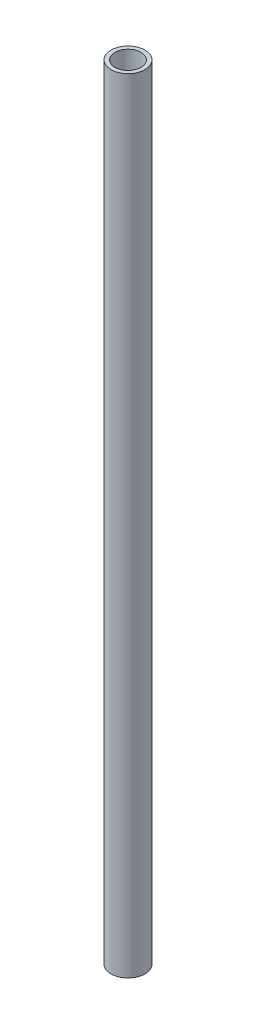
ISO-10303-21;
HEADER;
FILE_DESCRIPTION(('STEP AP214'),'2;1');
FILE_NAME('part.step','',(''),(''),'','','');
FILE_SCHEMA(('AUTOMOTIVE_DESIGN { 1 0 10303 214 1 1 1 1 }'));
ENDSEC;
DATA;
#1=APPLICATION_CONTEXT('core data for automotive mechanical design processes');
#2=APPLICATION_PROTOCOL_DEFINITION('international standard','automotive_design',2000,#1);
#3=PRODUCT_CONTEXT('',#1,'mechanical');
#4=PRODUCT('Part','Part','',(#3));
#5=PRODUCT_RELATED_PRODUCT_CATEGORY('part','',(#4));
#6=PRODUCT_DEFINITION_FORMATION('','',#4);
#7=PRODUCT_DEFINITION_CONTEXT('part definition',#1,'design');
#8=PRODUCT_DEFINITION('design','',#6,#7);
#9=PRODUCT_DEFINITION_SHAPE('','',#8);
#10=(LENGTH_UNIT() NAMED_UNIT(*) SI_UNIT(.MILLI.,.METRE.));
#11=(NAMED_UNIT(*) PLANE_ANGLE_UNIT() SI_UNIT($,.RADIAN.));
#12=(NAMED_UNIT(*) SI_UNIT($,.STERADIAN.) SOLID_ANGLE_UNIT());
#13=UNCERTAINTY_MEASURE_WITH_UNIT(LENGTH_MEASURE(1.E-05),#10,'distance_accuracy_value','');
#14=(GEOMETRIC_REPRESENTATION_CONTEXT(3) GLOBAL_UNCERTAINTY_ASSIGNED_CONTEXT((#13)) GLOBAL_UNIT_ASSIGNED_CONTEXT((#10,
#11,#12)) REPRESENTATION_CONTEXT('',''));
#15=CARTESIAN_POINT('',(0.,0.,0.));
#16=DIRECTION('',(0.,0.,1.));
#17=DIRECTION('',(1.,0.,0.));
#18=AXIS2_PLACEMENT_3D('',#15,#16,#17);
#19=CARTESIAN_POINT('',(0.,300.,0.));
#20=DIRECTION('',(0.,-1.,0.));
#21=DIRECTION('',(0.,0.,-1.));
#22=AXIS2_PLACEMENT_3D('',#19,#20,#21);
#23=CYLINDRICAL_SURFACE('',#22,3.5);
#24=CARTESIAN_POINT('',(0.,31.,0.));
#25=DIRECTION('',(0.,1.,0.));
#26=DIRECTION('',(0.,0.,1.));
#27=AXIS2_PLACEMENT_3D('',#24,#25,#26);
#28=CIRCLE('',#27,3.5);
#29=CARTESIAN_POINT('',(0.,31.,3.5));
#30=VERTEX_POINT('',#29);
#31=EDGE_CURVE('E41',#30,#30,#28,.T.);
#32=ORIENTED_EDGE('',*,*,#31,.F.);
#33=EDGE_LOOP('',(#32));
#34=FACE_BOUND('',#33,.T.);
#35=CARTESIAN_POINT('',(0.,269.,0.));
#36=DIRECTION('',(0.,1.,0.));
#37=DIRECTION('',(0.,0.,1.));
#38=AXIS2_PLACEMENT_3D('',#35,#36,#37);
#39=CIRCLE('',#38,3.5);
#40=CARTESIAN_POINT('',(0.,269.,3.5));
#41=VERTEX_POINT('',#40);
#42=EDGE_CURVE('E52',#41,#41,#39,.T.);
#43=ORIENTED_EDGE('',*,*,#42,.T.);
#44=EDGE_LOOP('',(#43));
#45=FACE_BOUND('',#44,.T.);
#46=ADVANCED_FACE('F37',(#34,#45),#23,.F.);
#47=CARTESIAN_POINT('',(0.,300.,0.));
#48=DIRECTION('',(0.,1.,0.));
#49=DIRECTION('',(0.,0.,1.));
#50=AXIS2_PLACEMENT_3D('',#47,#48,#49);
#51=PLANE('',#50);
#52=CARTESIAN_POINT('',(0.,300.,0.));
#53=DIRECTION('',(0.,1.,0.));
#54=DIRECTION('',(0.,0.,1.));
#55=AXIS2_PLACEMENT_3D('',#52,#53,#54);
#56=CIRCLE('',#55,5.);
#57=CARTESIAN_POINT('',(0.,300.,5.));
#58=VERTEX_POINT('',#57);
#59=EDGE_CURVE('E55',#58,#58,#56,.T.);
#60=ORIENTED_EDGE('',*,*,#59,.F.);
#61=EDGE_LOOP('',(#60));
#62=FACE_BOUND('',#61,.T.);
#63=CARTESIAN_POINT('',(0.,300.,0.));
#64=DIRECTION('',(0.,1.,0.));
#65=DIRECTION('',(0.,0.,1.));
#66=AXIS2_PLACEMENT_3D('',#63,#64,#65);
#67=CIRCLE('',#66,6.5);
#68=CARTESIAN_POINT('',(0.,300.,6.5));
#69=VERTEX_POINT('',#68);
#70=EDGE_CURVE('E10',#69,#69,#67,.T.);
#71=ORIENTED_EDGE('',*,*,#70,.T.);
#72=EDGE_LOOP('',(#71));
#73=FACE_BOUND('',#72,.T.);
#74=ADVANCED_FACE('F86',(#62,#73),#51,.T.);
#75=CARTESIAN_POINT('',(0.,0.,0.));
#76=DIRECTION('',(0.,1.,0.));
#77=DIRECTION('',(0.,0.,1.));
#78=AXIS2_PLACEMENT_3D('',#75,#76,#77);
#79=PLANE('',#78);
#80=CARTESIAN_POINT('',(0.,0.,0.));
#81=DIRECTION('',(0.,1.,0.));
#82=DIRECTION('',(0.,0.,1.));
#83=AXIS2_PLACEMENT_3D('',#80,#81,#82);
#84=CIRCLE('',#83,5.);
#85=CARTESIAN_POINT('',(0.,0.,5.));
#86=VERTEX_POINT('',#85);
#87=EDGE_CURVE('E69',#86,#86,#84,.T.);
#88=ORIENTED_EDGE('',*,*,#87,.T.);
#89=EDGE_LOOP('',(#88));
#90=FACE_BOUND('',#89,.T.);
#91=CARTESIAN_POINT('',(0.,0.,0.));
#92=DIRECTION('',(0.,1.,0.));
#93=DIRECTION('',(0.,0.,1.));
#94=AXIS2_PLACEMENT_3D('',#91,#92,#93);
#95=CIRCLE('',#94,6.5);
#96=CARTESIAN_POINT('',(0.,0.,6.5));
#97=VERTEX_POINT('',#96);
#98=EDGE_CURVE('E46',#97,#97,#95,.T.);
#99=ORIENTED_EDGE('',*,*,#98,.F.);
#100=EDGE_LOOP('',(#99));
#101=FACE_BOUND('',#100,.T.);
#102=ADVANCED_FACE('F91',(#90,#101),#79,.F.);
#103=CARTESIAN_POINT('',(0.,300.,0.));
#104=DIRECTION('',(0.,-1.,0.));
#105=DIRECTION('',(0.,0.,-1.));
#106=AXIS2_PLACEMENT_3D('',#103,#104,#105);
#107=CYLINDRICAL_SURFACE('',#106,6.5);
#108=ORIENTED_EDGE('',*,*,#70,.F.);
#109=EDGE_LOOP('',(#108));
#110=FACE_BOUND('',#109,.T.);
#111=ORIENTED_EDGE('',*,*,#98,.T.);
#112=EDGE_LOOP('',(#111));
#113=FACE_BOUND('',#112,.T.);
#114=ADVANCED_FACE('F39',(#110,#113),#107,.T.);
#115=CARTESIAN_POINT('',(0.,269.,0.));
#116=DIRECTION('',(0.,1.,0.));
#117=DIRECTION('',(0.,0.,1.));
#118=AXIS2_PLACEMENT_3D('',#115,#116,#117);
#119=CYLINDRICAL_SURFACE('',#118,5.);
#120=CARTESIAN_POINT('',(0.,269.,0.));
#121=DIRECTION('',(0.,1.,0.));
#122=DIRECTION('',(0.,0.,1.));
#123=AXIS2_PLACEMENT_3D('',#120,#121,#122);
#124=CIRCLE('',#123,5.);
#125=CARTESIAN_POINT('',(0.,269.,5.));
#126=VERTEX_POINT('',#125);
#127=EDGE_CURVE('E59',#126,#126,#124,.T.);
#128=ORIENTED_EDGE('',*,*,#127,.F.);
#129=EDGE_LOOP('',(#128));
#130=FACE_BOUND('',#129,.T.);
#131=ORIENTED_EDGE('',*,*,#59,.T.);
#132=EDGE_LOOP('',(#131));
#133=FACE_BOUND('',#132,.T.);
#134=ADVANCED_FACE('F95',(#130,#133),#119,.F.);
#135=CARTESIAN_POINT('',(0.,269.,0.));
#136=DIRECTION('',(0.,1.,0.));
#137=DIRECTION('',(0.,0.,1.));
#138=AXIS2_PLACEMENT_3D('',#135,#136,#137);
#139=PLANE('',#138);
#140=ORIENTED_EDGE('',*,*,#42,.F.);
#141=EDGE_LOOP('',(#140));
#142=FACE_BOUND('',#141,.T.);
#143=ORIENTED_EDGE('',*,*,#127,.T.);
#144=EDGE_LOOP('',(#143));
#145=FACE_BOUND('',#144,.T.);
#146=ADVANCED_FACE('F110',(#142,#145),#139,.T.);
#147=CARTESIAN_POINT('',(0.,31.,0.));
#148=DIRECTION('',(0.,-1.,0.));
#149=DIRECTION('',(0.,0.,-1.));
#150=AXIS2_PLACEMENT_3D('',#147,#148,#149);
#151=CYLINDRICAL_SURFACE('',#150,5.);
#152=CARTESIAN_POINT('',(0.,31.,0.));
#153=DIRECTION('',(0.,1.,0.));
#154=DIRECTION('',(0.,0.,1.));
#155=AXIS2_PLACEMENT_3D('',#152,#153,#154);
#156=CIRCLE('',#155,5.);
#157=CARTESIAN_POINT('',(0.,31.,5.));
#158=VERTEX_POINT('',#157);
#159=EDGE_CURVE('E73',#158,#158,#156,.T.);
#160=ORIENTED_EDGE('',*,*,#159,.T.);
#161=EDGE_LOOP('',(#160));
#162=FACE_BOUND('',#161,.T.);
#163=ORIENTED_EDGE('',*,*,#87,.F.);
#164=EDGE_LOOP('',(#163));
#165=FACE_BOUND('',#164,.T.);
#166=ADVANCED_FACE('F108',(#162,#165),#151,.F.);
#167=CARTESIAN_POINT('',(0.,31.,0.));
#168=DIRECTION('',(0.,1.,0.));
#169=DIRECTION('',(0.,0.,1.));
#170=AXIS2_PLACEMENT_3D('',#167,#168,#169);
#171=PLANE('',#170);
#172=ORIENTED_EDGE('',*,*,#31,.T.);
#173=EDGE_LOOP('',(#172));
#174=FACE_BOUND('',#173,.T.);
#175=ORIENTED_EDGE('',*,*,#159,.F.);
#176=EDGE_LOOP('',(#175));
#177=FACE_BOUND('',#176,.T.);
#178=ADVANCED_FACE('F82',(#174,#177),#171,.F.);
#179=CLOSED_SHELL('',(#46,#74,#102,#114,#134,#146,#166,#178));
#180=MANIFOLD_SOLID_BREP('B2',#179);
#181=ADVANCED_BREP_SHAPE_REPRESENTATION('',(#18,#180),#14);
#182=SHAPE_DEFINITION_REPRESENTATION(#9,#181);
ENDSEC;
END-ISO-10303-21;
